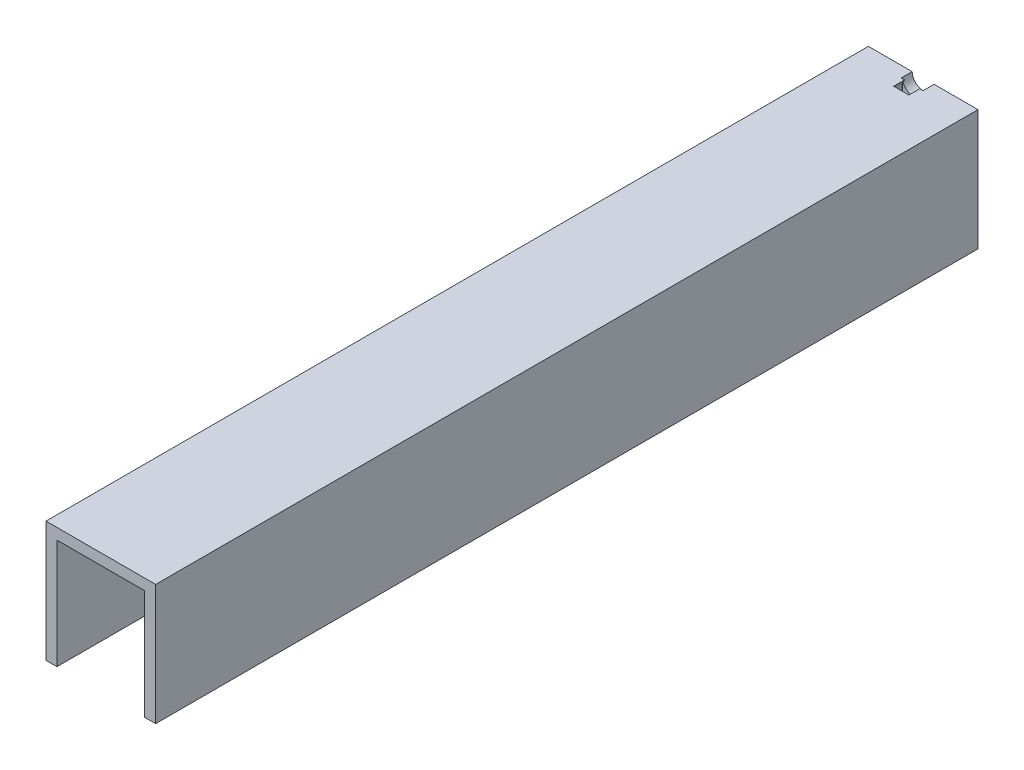
ISO-10303-21;
HEADER;
FILE_DESCRIPTION(('STEP AP214'),'2;1');
FILE_NAME('part.step','',(''),(''),'','','');
FILE_SCHEMA(('AUTOMOTIVE_DESIGN { 1 0 10303 214 1 1 1 1 }'));
ENDSEC;
DATA;
#1=APPLICATION_CONTEXT('core data for automotive mechanical design processes');
#2=APPLICATION_PROTOCOL_DEFINITION('international standard','automotive_design',2000,#1);
#3=PRODUCT_CONTEXT('',#1,'mechanical');
#4=PRODUCT('Part','Part','',(#3));
#5=PRODUCT_RELATED_PRODUCT_CATEGORY('part','',(#4));
#6=PRODUCT_DEFINITION_FORMATION('','',#4);
#7=PRODUCT_DEFINITION_CONTEXT('part definition',#1,'design');
#8=PRODUCT_DEFINITION('design','',#6,#7);
#9=PRODUCT_DEFINITION_SHAPE('','',#8);
#10=(LENGTH_UNIT() NAMED_UNIT(*) SI_UNIT(.MILLI.,.METRE.));
#11=(NAMED_UNIT(*) PLANE_ANGLE_UNIT() SI_UNIT($,.RADIAN.));
#12=(NAMED_UNIT(*) SI_UNIT($,.STERADIAN.) SOLID_ANGLE_UNIT());
#13=UNCERTAINTY_MEASURE_WITH_UNIT(LENGTH_MEASURE(1.E-05),#10,'distance_accuracy_value','');
#14=(GEOMETRIC_REPRESENTATION_CONTEXT(3) GLOBAL_UNCERTAINTY_ASSIGNED_CONTEXT((#13)) GLOBAL_UNIT_ASSIGNED_CONTEXT((#10,
#11,#12)) REPRESENTATION_CONTEXT('',''));
#15=CARTESIAN_POINT('',(0.,0.,0.));
#16=DIRECTION('',(0.,0.,1.));
#17=DIRECTION('',(1.,0.,0.));
#18=AXIS2_PLACEMENT_3D('',#15,#16,#17);
#19=CARTESIAN_POINT('',(0.,40.,0.));
#20=DIRECTION('',(0.,1.,0.));
#21=DIRECTION('',(1.,0.,0.));
#22=AXIS2_PLACEMENT_3D('',#19,#20,#21);
#23=PLANE('',#22);
#24=DIRECTION('',(1.07552855510562E-13,0.,-1.));
#25=VECTOR('',#24,1.);
#26=CARTESIAN_POINT('',(10.,40.,10.));
#27=LINE('',#26,#25);
#28=CARTESIAN_POINT('',(10.,40.,10.));
#29=VERTEX_POINT('',#28);
#30=CARTESIAN_POINT('',(10.,40.,9.));
#31=VERTEX_POINT('',#30);
#32=EDGE_CURVE('E412',#29,#31,#27,.T.);
#33=ORIENTED_EDGE('',*,*,#32,.T.);
#34=DIRECTION('',(-1.,0.,0.));
#35=VECTOR('',#34,1.);
#36=CARTESIAN_POINT('',(10.,40.,9.));
#37=LINE('',#36,#35);
#38=CARTESIAN_POINT('',(-10.,40.,9.));
#39=VERTEX_POINT('',#38);
#40=EDGE_CURVE('E28',#31,#39,#37,.T.);
#41=ORIENTED_EDGE('',*,*,#40,.T.);
#42=DIRECTION('',(1.14491749414469E-13,0.,1.));
#43=VECTOR('',#42,1.);
#44=CARTESIAN_POINT('',(-10.,40.,10.));
#45=LINE('',#44,#43);
#46=CARTESIAN_POINT('',(-10.,40.,10.));
#47=VERTEX_POINT('',#46);
#48=EDGE_CURVE('E10',#39,#47,#45,.T.);
#49=ORIENTED_EDGE('',*,*,#48,.T.);
#50=DIRECTION('',(1.,0.,0.));
#51=VECTOR('',#50,1.);
#52=CARTESIAN_POINT('',(-6.94658370459002,40.,10.));
#53=LINE('',#52,#51);
#54=EDGE_CURVE('E331',#47,#29,#53,.T.);
#55=ORIENTED_EDGE('',*,*,#54,.T.);
#56=EDGE_LOOP('',(#33,#41,#49,#55));
#57=FACE_BOUND('',#56,.T.);
#58=ADVANCED_FACE('F15',(#57),#23,.T.);
#59=CARTESIAN_POINT('',(-10.,40.,10.));
#60=DIRECTION('',(-1.,0.,1.14491749414469E-13));
#61=DIRECTION('',(0.,1.,0.));
#62=AXIS2_PLACEMENT_3D('',#59,#60,#61);
#63=PLANE('',#62);
#64=DIRECTION('',(0.,0.,-1.));
#65=VECTOR('',#64,1.);
#66=CARTESIAN_POINT('',(-10.,55.,10.));
#67=LINE('',#66,#65);
#68=CARTESIAN_POINT('',(-10.,55.,10.));
#69=VERTEX_POINT('',#68);
#70=CARTESIAN_POINT('',(-10.,55.,9.));
#71=VERTEX_POINT('',#70);
#72=EDGE_CURVE('E292',#69,#71,#67,.T.);
#73=ORIENTED_EDGE('',*,*,#72,.F.);
#74=DIRECTION('',(0.,1.,0.));
#75=VECTOR('',#74,1.);
#76=CARTESIAN_POINT('',(-10.,40.,10.));
#77=LINE('',#76,#75);
#78=CARTESIAN_POINT('',(-10.,45.,10.));
#79=VERTEX_POINT('',#78);
#80=EDGE_CURVE('E311',#79,#69,#77,.T.);
#81=ORIENTED_EDGE('',*,*,#80,.F.);
#82=DIRECTION('',(0.,1.,0.));
#83=VECTOR('',#82,1.);
#84=CARTESIAN_POINT('',(-10.,40.,10.));
#85=LINE('',#84,#83);
#86=EDGE_CURVE('E325',#47,#79,#85,.T.);
#87=ORIENTED_EDGE('',*,*,#86,.F.);
#88=ORIENTED_EDGE('',*,*,#48,.F.);
#89=DIRECTION('',(0.,1.,0.));
#90=VECTOR('',#89,1.);
#91=CARTESIAN_POINT('',(-10.,40.,9.));
#92=LINE('',#91,#90);
#93=EDGE_CURVE('E416',#39,#71,#92,.T.);
#94=ORIENTED_EDGE('',*,*,#93,.T.);
#95=EDGE_LOOP('',(#73,#81,#87,#88,#94));
#96=FACE_BOUND('',#95,.T.);
#97=ADVANCED_FACE('F268',(#96),#63,.F.);
#98=CARTESIAN_POINT('',(10.,40.,9.));
#99=DIRECTION('',(0.,0.,-1.));
#100=DIRECTION('',(0.,-1.,0.));
#101=AXIS2_PLACEMENT_3D('',#98,#99,#100);
#102=PLANE('',#101);
#103=CARTESIAN_POINT('',(0.,55.,9.));
#104=DIRECTION('',(0.,0.,-1.));
#105=DIRECTION('',(-1.,0.,0.));
#106=AXIS2_PLACEMENT_3D('',#103,#104,#105);
#107=CIRCLE('',#106,10.);
#108=CARTESIAN_POINT('',(10.,55.,9.));
#109=VERTEX_POINT('',#108);
#110=EDGE_CURVE('E350',#109,#71,#107,.T.);
#111=ORIENTED_EDGE('',*,*,#110,.T.);
#112=ORIENTED_EDGE('',*,*,#93,.F.);
#113=ORIENTED_EDGE('',*,*,#40,.F.);
#114=DIRECTION('',(0.,1.,0.));
#115=VECTOR('',#114,1.);
#116=CARTESIAN_POINT('',(10.,40.,9.));
#117=LINE('',#116,#115);
#118=EDGE_CURVE('E349',#31,#109,#117,.T.);
#119=ORIENTED_EDGE('',*,*,#118,.T.);
#120=EDGE_LOOP('',(#111,#112,#113,#119));
#121=FACE_BOUND('',#120,.T.);
#122=ADVANCED_FACE('F645',(#121),#102,.F.);
#123=CARTESIAN_POINT('',(10.,40.,10.));
#124=DIRECTION('',(1.,0.,1.07552855510562E-13));
#125=DIRECTION('',(-1.07552855510562E-13,0.,1.));
#126=AXIS2_PLACEMENT_3D('',#123,#124,#125);
#127=PLANE('',#126);
#128=DIRECTION('',(0.,0.,-1.));
#129=VECTOR('',#128,1.);
#130=CARTESIAN_POINT('',(10.,55.,10.));
#131=LINE('',#130,#129);
#132=CARTESIAN_POINT('',(10.,55.,10.));
#133=VERTEX_POINT('',#132);
#134=EDGE_CURVE('E176',#133,#109,#131,.T.);
#135=ORIENTED_EDGE('',*,*,#134,.T.);
#136=ORIENTED_EDGE('',*,*,#118,.F.);
#137=ORIENTED_EDGE('',*,*,#32,.F.);
#138=DIRECTION('',(0.,1.,0.));
#139=VECTOR('',#138,1.);
#140=CARTESIAN_POINT('',(10.,40.,10.));
#141=LINE('',#140,#139);
#142=CARTESIAN_POINT('',(10.,45.,10.));
#143=VERTEX_POINT('',#142);
#144=EDGE_CURVE('E361',#29,#143,#141,.T.);
#145=ORIENTED_EDGE('',*,*,#144,.T.);
#146=DIRECTION('',(0.,1.,0.));
#147=VECTOR('',#146,1.);
#148=CARTESIAN_POINT('',(10.,40.,10.));
#149=LINE('',#148,#147);
#150=EDGE_CURVE('E136',#143,#133,#149,.T.);
#151=ORIENTED_EDGE('',*,*,#150,.T.);
#152=EDGE_LOOP('',(#135,#136,#137,#145,#151));
#153=FACE_BOUND('',#152,.T.);
#154=ADVANCED_FACE('F195',(#153),#127,.F.);
#155=CARTESIAN_POINT('',(0.,55.,10.));
#156=DIRECTION('',(0.,0.,1.));
#157=DIRECTION('',(1.,0.,0.));
#158=AXIS2_PLACEMENT_3D('',#155,#156,#157);
#159=PLANE('',#158);
#160=CARTESIAN_POINT('',(-9.99695367108951,45.,10.));
#161=CARTESIAN_POINT('',(-9.96494319264532,46.8664581448352,10.));
#162=CARTESIAN_POINT('',(-9.39001372180576,50.5804550021323,10.));
#163=CARTESIAN_POINT('',(-7.87952848473726,53.7030541342102,10.));
#164=CARTESIAN_POINT('',(-6.94658370459002,55.,10.));
#165=(BOUNDED_CURVE() B_SPLINE_CURVE(3,(#160,#161,#162,#163,#164),.UNSPECIFIED.,.F.,
.F.) B_SPLINE_CURVE_WITH_KNOTS((4,1,4),(0.767944870877509,1.15702863061443,1.54611239035136),
.UNSPECIFIED.) CURVE() GEOMETRIC_REPRESENTATION_ITEM() RATIONAL_B_SPLINE_CURVE((1.,1.,1.,1.,1.)) REPRESENTATION_ITEM(''));
#166=CARTESIAN_POINT('',(-6.94658370459002,55.,10.));
#167=VERTEX_POINT('',#166);
#168=CARTESIAN_POINT('',(-9.99695367108951,45.,10.));
#169=VERTEX_POINT('',#168);
#170=EDGE_CURVE('E113',#167,#169,#165,.F.);
#171=ORIENTED_EDGE('',*,*,#170,.T.);
#172=DIRECTION('',(-1.,0.,0.));
#173=VECTOR('',#172,1.);
#174=CARTESIAN_POINT('',(50.,45.,10.));
#175=LINE('',#174,#173);
#176=EDGE_CURVE('E147',#169,#79,#175,.T.);
#177=ORIENTED_EDGE('',*,*,#176,.T.);
#178=ORIENTED_EDGE('',*,*,#80,.T.);
#179=DIRECTION('',(-1.,0.,0.));
#180=VECTOR('',#179,1.);
#181=CARTESIAN_POINT('',(0.,55.,10.));
#182=LINE('',#181,#180);
#183=EDGE_CURVE('E288',#167,#69,#182,.T.);
#184=ORIENTED_EDGE('',*,*,#183,.F.);
#185=EDGE_LOOP('',(#171,#177,#178,#184));
#186=FACE_BOUND('',#185,.T.);
#187=ADVANCED_FACE('F184',(#186),#159,.F.);
#188=CARTESIAN_POINT('',(0.,55.,10.));
#189=DIRECTION('',(0.,0.,-1.));
#190=DIRECTION('',(-1.,0.,0.));
#191=AXIS2_PLACEMENT_3D('',#188,#189,#190);
#192=CYLINDRICAL_SURFACE('',#191,10.);
#193=ORIENTED_EDGE('',*,*,#110,.F.);
#194=DIRECTION('',(0.,0.,-1.));
#195=VECTOR('',#194,1.);
#196=CARTESIAN_POINT('',(10.,55.,10.));
#197=LINE('',#196,#195);
#198=CARTESIAN_POINT('',(10.,55.,0.));
#199=VERTEX_POINT('',#198);
#200=EDGE_CURVE('E381',#109,#199,#197,.T.);
#201=ORIENTED_EDGE('',*,*,#200,.T.);
#202=CARTESIAN_POINT('',(0.,55.,0.));
#203=DIRECTION('',(0.,0.,1.));
#204=DIRECTION('',(-1.,0.,0.));
#205=AXIS2_PLACEMENT_3D('',#202,#203,#204);
#206=CIRCLE('',#205,10.);
#207=CARTESIAN_POINT('',(-10.,55.,0.));
#208=VERTEX_POINT('',#207);
#209=EDGE_CURVE('E360',#208,#199,#206,.T.);
#210=ORIENTED_EDGE('',*,*,#209,.F.);
#211=DIRECTION('',(0.,0.,-1.));
#212=VECTOR('',#211,1.);
#213=CARTESIAN_POINT('',(-10.,55.,10.));
#214=LINE('',#213,#212);
#215=EDGE_CURVE('E389',#71,#208,#214,.T.);
#216=ORIENTED_EDGE('',*,*,#215,.F.);
#217=EDGE_LOOP('',(#193,#201,#210,#216));
#218=FACE_BOUND('',#217,.T.);
#219=ADVANCED_FACE('F194',(#218),#192,.F.);
#220=CARTESIAN_POINT('',(0.,55.,10.));
#221=DIRECTION('',(0.,0.,1.));
#222=DIRECTION('',(1.,0.,0.));
#223=AXIS2_PLACEMENT_3D('',#220,#221,#222);
#224=PLANE('',#223);
#225=CARTESIAN_POINT('',(6.94658370459002,55.,10.));
#226=CARTESIAN_POINT('',(7.87952848473726,53.7030541342102,10.));
#227=CARTESIAN_POINT('',(9.39001372180576,50.5804550021323,10.));
#228=CARTESIAN_POINT('',(9.96494319264532,46.8664581448352,10.));
#229=CARTESIAN_POINT('',(9.99695367108951,45.,10.));
#230=(BOUNDED_CURVE() B_SPLINE_CURVE(3,(#225,#226,#227,#228,#229),.UNSPECIFIED.,.F.,
.F.) B_SPLINE_CURVE_WITH_KNOTS((4,1,4),(4.73707291682822,5.12615667656515,5.51524043630208),
.UNSPECIFIED.) CURVE() GEOMETRIC_REPRESENTATION_ITEM() RATIONAL_B_SPLINE_CURVE((1.,1.,1.,1.,1.)) REPRESENTATION_ITEM(''));
#231=CARTESIAN_POINT('',(9.99695367108951,45.,10.));
#232=VERTEX_POINT('',#231);
#233=CARTESIAN_POINT('',(6.94658370458999,55.,10.));
#234=VERTEX_POINT('',#233);
#235=EDGE_CURVE('E121',#232,#234,#230,.F.);
#236=ORIENTED_EDGE('',*,*,#235,.T.);
#237=DIRECTION('',(-1.,0.,0.));
#238=VECTOR('',#237,1.);
#239=CARTESIAN_POINT('',(0.,55.,10.));
#240=LINE('',#239,#238);
#241=EDGE_CURVE('E171',#133,#234,#240,.T.);
#242=ORIENTED_EDGE('',*,*,#241,.F.);
#243=ORIENTED_EDGE('',*,*,#150,.F.);
#244=DIRECTION('',(-1.,0.,0.));
#245=VECTOR('',#244,1.);
#246=CARTESIAN_POINT('',(50.,45.,10.));
#247=LINE('',#246,#245);
#248=EDGE_CURVE('E140',#143,#232,#247,.T.);
#249=ORIENTED_EDGE('',*,*,#248,.T.);
#250=EDGE_LOOP('',(#236,#242,#243,#249));
#251=FACE_BOUND('',#250,.T.);
#252=ADVANCED_FACE('F141',(#251),#224,.F.);
#253=CARTESIAN_POINT('',(9.99695367108951,45.,20.));
#254=CARTESIAN_POINT('',(9.99695367108951,45.,10.));
#255=CARTESIAN_POINT('',(9.96494319264532,46.8664581448352,20.));
#256=CARTESIAN_POINT('',(9.96494319264532,46.8664581448352,10.));
#257=CARTESIAN_POINT('',(9.39001372180576,50.5804550021323,20.));
#258=CARTESIAN_POINT('',(9.39001372180576,50.5804550021323,10.));
#259=CARTESIAN_POINT('',(7.87952848473726,53.7030541342102,20.));
#260=CARTESIAN_POINT('',(7.87952848473726,53.7030541342102,10.));
#261=CARTESIAN_POINT('',(6.94658370459002,55.,20.));
#262=CARTESIAN_POINT('',(6.94658370459002,55.,10.));
#263=(BOUNDED_SURFACE() B_SPLINE_SURFACE(3,1,((#253,#254),(#255,#256),(#257,#258),(#259,#260),
(#261,#262)),.UNSPECIFIED.,.F.,.F.,.F.) B_SPLINE_SURFACE_WITH_KNOTS((4,1,4),(2,2),
(4.73707291682822,5.12615667656515,5.51524043630208),(0.,1.),
.UNSPECIFIED.) GEOMETRIC_REPRESENTATION_ITEM() RATIONAL_B_SPLINE_SURFACE(((1.,1.),(1.,1.),(1.,
1.),(1.,1.),(1.,1.))) REPRESENTATION_ITEM('') SURFACE());
#264=CARTESIAN_POINT('',(9.99695367108951,45.,20.));
#265=CARTESIAN_POINT('',(9.96494319264532,46.8664581448352,20.));
#266=CARTESIAN_POINT('',(9.39001372180576,50.5804550021323,20.));
#267=CARTESIAN_POINT('',(7.87952848473726,53.7030541342102,20.));
#268=CARTESIAN_POINT('',(6.94658370459002,55.,20.));
#269=(BOUNDED_CURVE() B_SPLINE_CURVE(3,(#264,#265,#266,#267,#268),.UNSPECIFIED.,.F.,
.F.) B_SPLINE_CURVE_WITH_KNOTS((4,1,4),(4.73707291682822,5.12615667656515,5.51524043630208),
.UNSPECIFIED.) CURVE() GEOMETRIC_REPRESENTATION_ITEM() RATIONAL_B_SPLINE_CURVE((1.,1.,1.,1.,1.)) REPRESENTATION_ITEM(''));
#270=CARTESIAN_POINT('',(6.94658370459002,55.,20.));
#271=VERTEX_POINT('',#270);
#272=CARTESIAN_POINT('',(9.99695367108951,45.,20.));
#273=VERTEX_POINT('',#272);
#274=EDGE_CURVE('E225',#271,#273,#269,.F.);
#275=DIRECTION('',(0.,0.,-1.));
#276=VECTOR('',#275,1.);
#277=CARTESIAN_POINT('',(6.94658370459002,55.,24.0249035518016));
#278=LINE('',#277,#276);
#279=EDGE_CURVE('E130',#271,#234,#278,.T.);
#280=DIRECTION('',(0.,0.,-1.));
#281=VECTOR('',#280,1.);
#282=CARTESIAN_POINT('',(9.99695367108951,45.,24.0249035518016));
#283=LINE('',#282,#281);
#284=EDGE_CURVE('E127',#273,#232,#283,.T.);
#285=ORIENTED_EDGE('',*,*,#274,.F.);
#286=ORIENTED_EDGE('',*,*,#279,.T.);
#287=ORIENTED_EDGE('',*,*,#235,.F.);
#288=ORIENTED_EDGE('',*,*,#284,.F.);
#289=EDGE_LOOP('',(#285,#286,#287,#288));
#290=FACE_BOUND('',#289,.T.);
#291=ADVANCED_FACE('F125',(#290),#263,.T.);
#292=CARTESIAN_POINT('',(-6.94658370459002,55.,20.));
#293=CARTESIAN_POINT('',(-6.94658370459002,55.,10.));
#294=CARTESIAN_POINT('',(-7.87952848473726,53.7030541342102,20.));
#295=CARTESIAN_POINT('',(-7.87952848473726,53.7030541342102,10.));
#296=CARTESIAN_POINT('',(-9.39001372180576,50.5804550021323,20.));
#297=CARTESIAN_POINT('',(-9.39001372180576,50.5804550021323,10.));
#298=CARTESIAN_POINT('',(-9.96494319264532,46.8664581448352,20.));
#299=CARTESIAN_POINT('',(-9.96494319264532,46.8664581448352,10.));
#300=CARTESIAN_POINT('',(-9.99695367108951,45.,20.));
#301=CARTESIAN_POINT('',(-9.99695367108951,45.,10.));
#302=(BOUNDED_SURFACE() B_SPLINE_SURFACE(3,1,((#292,#293),(#294,#295),(#296,#297),(#298,#299),
(#300,#301)),.UNSPECIFIED.,.F.,.F.,.F.) B_SPLINE_SURFACE_WITH_KNOTS((4,1,4),(2,2),
(0.767944870877509,1.15702863061444,1.54611239035136),(0.,1.),
.UNSPECIFIED.) GEOMETRIC_REPRESENTATION_ITEM() RATIONAL_B_SPLINE_SURFACE(((1.,1.),(1.,1.),(1.,
1.),(1.,1.),(1.,1.))) REPRESENTATION_ITEM('') SURFACE());
#303=CARTESIAN_POINT('',(-6.94658370459002,55.,20.));
#304=CARTESIAN_POINT('',(-7.87952848473726,53.7030541342102,20.));
#305=CARTESIAN_POINT('',(-9.39001372180576,50.5804550021323,20.));
#306=CARTESIAN_POINT('',(-9.96494319264532,46.8664581448352,20.));
#307=CARTESIAN_POINT('',(-9.99695367108951,45.,20.));
#308=(BOUNDED_CURVE() B_SPLINE_CURVE(3,(#303,#304,#305,#306,#307),.UNSPECIFIED.,.F.,
.F.) B_SPLINE_CURVE_WITH_KNOTS((4,1,4),(0.767944870877509,1.15702863061444,1.54611239035136),
.UNSPECIFIED.) CURVE() GEOMETRIC_REPRESENTATION_ITEM() RATIONAL_B_SPLINE_CURVE((1.,1.,1.,1.,1.)) REPRESENTATION_ITEM(''));
#309=CARTESIAN_POINT('',(-9.99695367108951,45.,20.));
#310=VERTEX_POINT('',#309);
#311=CARTESIAN_POINT('',(-6.94658370459002,55.,20.));
#312=VERTEX_POINT('',#311);
#313=EDGE_CURVE('E234',#310,#312,#308,.F.);
#314=DIRECTION('',(0.,0.,-1.));
#315=VECTOR('',#314,1.);
#316=CARTESIAN_POINT('',(-9.99695367108951,45.,24.0249035518016));
#317=LINE('',#316,#315);
#318=EDGE_CURVE('E296',#310,#169,#317,.T.);
#319=DIRECTION('',(0.,0.,-1.));
#320=VECTOR('',#319,1.);
#321=CARTESIAN_POINT('',(-6.94658370459002,55.,24.0249035518016));
#322=LINE('',#321,#320);
#323=EDGE_CURVE('E162',#312,#167,#322,.T.);
#324=ORIENTED_EDGE('',*,*,#313,.F.);
#325=ORIENTED_EDGE('',*,*,#318,.T.);
#326=ORIENTED_EDGE('',*,*,#170,.F.);
#327=ORIENTED_EDGE('',*,*,#323,.F.);
#328=EDGE_LOOP('',(#324,#325,#326,#327));
#329=FACE_BOUND('',#328,.T.);
#330=ADVANCED_FACE('F255',(#329),#302,.T.);
#331=CARTESIAN_POINT('',(50.,45.,750.));
#332=DIRECTION('',(0.,-1.,0.));
#333=DIRECTION('',(0.,0.,-1.));
#334=AXIS2_PLACEMENT_3D('',#331,#332,#333);
#335=PLANE('',#334);
#336=DIRECTION('',(-1.,0.,0.));
#337=VECTOR('',#336,1.);
#338=CARTESIAN_POINT('',(10.,45.,20.));
#339=LINE('',#338,#337);
#340=EDGE_CURVE('E152',#273,#310,#339,.T.);
#341=ORIENTED_EDGE('',*,*,#340,.F.);
#342=ORIENTED_EDGE('',*,*,#284,.T.);
#343=ORIENTED_EDGE('',*,*,#248,.F.);
#344=DIRECTION('',(-1.,0.,0.));
#345=VECTOR('',#344,1.);
#346=CARTESIAN_POINT('',(50.,45.,10.));
#347=LINE('',#346,#345);
#348=CARTESIAN_POINT('',(40.,45.,10.));
#349=VERTEX_POINT('',#348);
#350=EDGE_CURVE('E362',#349,#143,#347,.T.);
#351=ORIENTED_EDGE('',*,*,#350,.F.);
#352=DIRECTION('',(0.,0.,-1.));
#353=VECTOR('',#352,1.);
#354=CARTESIAN_POINT('',(40.,45.,750.));
#355=LINE('',#354,#353);
#356=CARTESIAN_POINT('',(40.,45.,750.));
#357=VERTEX_POINT('',#356);
#358=EDGE_CURVE('E417',#357,#349,#355,.T.);
#359=ORIENTED_EDGE('',*,*,#358,.F.);
#360=DIRECTION('',(-1.,0.,0.));
#361=VECTOR('',#360,1.);
#362=CARTESIAN_POINT('',(50.,45.,750.));
#363=LINE('',#362,#361);
#364=CARTESIAN_POINT('',(-40.,45.,750.));
#365=VERTEX_POINT('',#364);
#366=EDGE_CURVE('E470',#357,#365,#363,.T.);
#367=ORIENTED_EDGE('',*,*,#366,.T.);
#368=DIRECTION('',(0.,0.,-1.));
#369=VECTOR('',#368,1.);
#370=CARTESIAN_POINT('',(-40.,45.,750.));
#371=LINE('',#370,#369);
#372=CARTESIAN_POINT('',(-40.,45.,10.));
#373=VERTEX_POINT('',#372);
#374=EDGE_CURVE('E155',#365,#373,#371,.T.);
#375=ORIENTED_EDGE('',*,*,#374,.T.);
#376=DIRECTION('',(-1.,0.,0.));
#377=VECTOR('',#376,1.);
#378=CARTESIAN_POINT('',(50.,45.,10.));
#379=LINE('',#378,#377);
#380=EDGE_CURVE('E316',#79,#373,#379,.T.);
#381=ORIENTED_EDGE('',*,*,#380,.F.);
#382=ORIENTED_EDGE('',*,*,#176,.F.);
#383=ORIENTED_EDGE('',*,*,#318,.F.);
#384=EDGE_LOOP('',(#341,#342,#343,#351,#359,#367,#375,#381,#382,#383));
#385=FACE_BOUND('',#384,.T.);
#386=ADVANCED_FACE('F149',(#385),#335,.T.);
#387=CARTESIAN_POINT('',(-40.,55.,750.));
#388=DIRECTION('',(1.,0.,0.));
#389=DIRECTION('',(0.,1.,0.));
#390=AXIS2_PLACEMENT_3D('',#387,#388,#389);
#391=PLANE('',#390);
#392=DIRECTION('',(0.,-1.,0.));
#393=VECTOR('',#392,1.);
#394=CARTESIAN_POINT('',(-40.,55.,10.));
#395=LINE('',#394,#393);
#396=CARTESIAN_POINT('',(-40.,-55.,10.));
#397=VERTEX_POINT('',#396);
#398=EDGE_CURVE('E324',#373,#397,#395,.T.);
#399=ORIENTED_EDGE('',*,*,#398,.F.);
#400=ORIENTED_EDGE('',*,*,#374,.F.);
#401=DIRECTION('',(0.,-1.,0.));
#402=VECTOR('',#401,1.);
#403=CARTESIAN_POINT('',(-40.,55.,750.));
#404=LINE('',#403,#402);
#405=CARTESIAN_POINT('',(-40.,-55.,750.));
#406=VERTEX_POINT('',#405);
#407=EDGE_CURVE('E374',#365,#406,#404,.T.);
#408=ORIENTED_EDGE('',*,*,#407,.T.);
#409=DIRECTION('',(0.,0.,-1.));
#410=VECTOR('',#409,1.);
#411=CARTESIAN_POINT('',(-40.,-55.,750.));
#412=LINE('',#411,#410);
#413=EDGE_CURVE('E385',#406,#397,#412,.T.);
#414=ORIENTED_EDGE('',*,*,#413,.T.);
#415=EDGE_LOOP('',(#399,#400,#408,#414));
#416=FACE_BOUND('',#415,.T.);
#417=ADVANCED_FACE('F520',(#416),#391,.T.);
#418=CARTESIAN_POINT('',(50.,55.,750.));
#419=DIRECTION('',(0.,-1.,0.));
#420=DIRECTION('',(0.,0.,-1.));
#421=AXIS2_PLACEMENT_3D('',#418,#419,#420);
#422=PLANE('',#421);
#423=ORIENTED_EDGE('',*,*,#183,.T.);
#424=ORIENTED_EDGE('',*,*,#72,.T.);
#425=ORIENTED_EDGE('',*,*,#215,.T.);
#426=DIRECTION('',(-1.,0.,0.));
#427=VECTOR('',#426,1.);
#428=CARTESIAN_POINT('',(50.,55.,0.));
#429=LINE('',#428,#427);
#430=CARTESIAN_POINT('',(-50.,55.,0.));
#431=VERTEX_POINT('',#430);
#432=EDGE_CURVE('E356',#208,#431,#429,.T.);
#433=ORIENTED_EDGE('',*,*,#432,.T.);
#434=DIRECTION('',(0.,0.,-1.));
#435=VECTOR('',#434,1.);
#436=CARTESIAN_POINT('',(-50.,55.,750.));
#437=LINE('',#436,#435);
#438=CARTESIAN_POINT('',(-50.,55.,750.));
#439=VERTEX_POINT('',#438);
#440=EDGE_CURVE('E382',#439,#431,#437,.T.);
#441=ORIENTED_EDGE('',*,*,#440,.F.);
#442=DIRECTION('',(-1.,0.,0.));
#443=VECTOR('',#442,1.);
#444=CARTESIAN_POINT('',(50.,55.,750.));
#445=LINE('',#444,#443);
#446=CARTESIAN_POINT('',(50.,55.,750.));
#447=VERTEX_POINT('',#446);
#448=EDGE_CURVE('E429',#447,#439,#445,.T.);
#449=ORIENTED_EDGE('',*,*,#448,.F.);
#450=DIRECTION('',(0.,0.,-1.));
#451=VECTOR('',#450,1.);
#452=CARTESIAN_POINT('',(50.,55.,750.));
#453=LINE('',#452,#451);
#454=CARTESIAN_POINT('',(50.,55.,0.));
#455=VERTEX_POINT('',#454);
#456=EDGE_CURVE('E293',#447,#455,#453,.T.);
#457=ORIENTED_EDGE('',*,*,#456,.T.);
#458=DIRECTION('',(-1.,0.,0.));
#459=VECTOR('',#458,1.);
#460=CARTESIAN_POINT('',(50.,55.,0.));
#461=LINE('',#460,#459);
#462=EDGE_CURVE('E369',#455,#199,#461,.T.);
#463=ORIENTED_EDGE('',*,*,#462,.T.);
#464=ORIENTED_EDGE('',*,*,#200,.F.);
#465=ORIENTED_EDGE('',*,*,#134,.F.);
#466=ORIENTED_EDGE('',*,*,#241,.T.);
#467=ORIENTED_EDGE('',*,*,#279,.F.);
#468=DIRECTION('',(-1.,0.,0.));
#469=VECTOR('',#468,1.);
#470=CARTESIAN_POINT('',(50.,55.,20.));
#471=LINE('',#470,#469);
#472=EDGE_CURVE('E230',#271,#312,#471,.T.);
#473=ORIENTED_EDGE('',*,*,#472,.T.);
#474=ORIENTED_EDGE('',*,*,#323,.T.);
#475=EDGE_LOOP('',(#423,#424,#425,#433,#441,#449,#457,#463,#464,#465,#466,#467,#473,#474));
#476=FACE_BOUND('',#475,.T.);
#477=ADVANCED_FACE('F201',(#476),#422,.F.);
#478=CARTESIAN_POINT('',(50.,-55.,750.));
#479=DIRECTION('',(-1.,0.,0.));
#480=DIRECTION('',(0.,0.,1.));
#481=AXIS2_PLACEMENT_3D('',#478,#479,#480);
#482=PLANE('',#481);
#483=DIRECTION('',(0.,1.,0.));
#484=VECTOR('',#483,1.);
#485=CARTESIAN_POINT('',(50.,-55.,0.));
#486=LINE('',#485,#484);
#487=CARTESIAN_POINT('',(50.,-55.,0.));
#488=VERTEX_POINT('',#487);
#489=EDGE_CURVE('E393',#488,#455,#486,.T.);
#490=ORIENTED_EDGE('',*,*,#489,.T.);
#491=ORIENTED_EDGE('',*,*,#456,.F.);
#492=DIRECTION('',(0.,1.,0.));
#493=VECTOR('',#492,1.);
#494=CARTESIAN_POINT('',(50.,-55.,750.));
#495=LINE('',#494,#493);
#496=CARTESIAN_POINT('',(50.,-55.,750.));
#497=VERTEX_POINT('',#496);
#498=EDGE_CURVE('E408',#497,#447,#495,.T.);
#499=ORIENTED_EDGE('',*,*,#498,.F.);
#500=DIRECTION('',(0.,0.,-1.));
#501=VECTOR('',#500,1.);
#502=CARTESIAN_POINT('',(50.,-55.,750.));
#503=LINE('',#502,#501);
#504=EDGE_CURVE('E340',#497,#488,#503,.T.);
#505=ORIENTED_EDGE('',*,*,#504,.T.);
#506=EDGE_LOOP('',(#490,#491,#499,#505));
#507=FACE_BOUND('',#506,.T.);
#508=ADVANCED_FACE('F197',(#507),#482,.F.);
#509=CARTESIAN_POINT('',(-50.,-55.,750.));
#510=DIRECTION('',(0.,1.,0.));
#511=DIRECTION('',(1.,0.,0.));
#512=AXIS2_PLACEMENT_3D('',#509,#510,#511);
#513=PLANE('',#512);
#514=DIRECTION('',(1.,0.,0.));
#515=VECTOR('',#514,1.);
#516=CARTESIAN_POINT('',(-50.,-55.,750.));
#517=LINE('',#516,#515);
#518=CARTESIAN_POINT('',(40.,-55.,750.));
#519=VERTEX_POINT('',#518);
#520=EDGE_CURVE('E355',#519,#497,#517,.T.);
#521=ORIENTED_EDGE('',*,*,#520,.F.);
#522=DIRECTION('',(0.,0.,-1.));
#523=VECTOR('',#522,1.);
#524=CARTESIAN_POINT('',(40.,-55.,750.));
#525=LINE('',#524,#523);
#526=CARTESIAN_POINT('',(40.,-55.,10.));
#527=VERTEX_POINT('',#526);
#528=EDGE_CURVE('E420',#519,#527,#525,.T.);
#529=ORIENTED_EDGE('',*,*,#528,.T.);
#530=DIRECTION('',(1.,0.,0.));
#531=VECTOR('',#530,1.);
#532=CARTESIAN_POINT('',(-50.,-55.,10.));
#533=LINE('',#532,#531);
#534=EDGE_CURVE('E342',#397,#527,#533,.T.);
#535=ORIENTED_EDGE('',*,*,#534,.F.);
#536=ORIENTED_EDGE('',*,*,#413,.F.);
#537=DIRECTION('',(1.,0.,0.));
#538=VECTOR('',#537,1.);
#539=CARTESIAN_POINT('',(-50.,-55.,750.));
#540=LINE('',#539,#538);
#541=CARTESIAN_POINT('',(-50.,-55.,750.));
#542=VERTEX_POINT('',#541);
#543=EDGE_CURVE('E370',#542,#406,#540,.T.);
#544=ORIENTED_EDGE('',*,*,#543,.F.);
#545=DIRECTION('',(0.,0.,-1.));
#546=VECTOR('',#545,1.);
#547=CARTESIAN_POINT('',(-50.,-55.,750.));
#548=LINE('',#547,#546);
#549=CARTESIAN_POINT('',(-50.,-55.,0.));
#550=VERTEX_POINT('',#549);
#551=EDGE_CURVE('E386',#542,#550,#548,.T.);
#552=ORIENTED_EDGE('',*,*,#551,.T.);
#553=DIRECTION('',(1.,0.,0.));
#554=VECTOR('',#553,1.);
#555=CARTESIAN_POINT('',(-50.,-55.,0.));
#556=LINE('',#555,#554);
#557=EDGE_CURVE('E244',#550,#488,#556,.T.);
#558=ORIENTED_EDGE('',*,*,#557,.T.);
#559=ORIENTED_EDGE('',*,*,#504,.F.);
#560=EDGE_LOOP('',(#521,#529,#535,#536,#544,#552,#558,#559));
#561=FACE_BOUND('',#560,.T.);
#562=ADVANCED_FACE('F200',(#561),#513,.F.);
#563=CARTESIAN_POINT('',(-50.,55.,750.));
#564=DIRECTION('',(1.,0.,0.));
#565=DIRECTION('',(0.,1.,0.));
#566=AXIS2_PLACEMENT_3D('',#563,#564,#565);
#567=PLANE('',#566);
#568=DIRECTION('',(0.,-1.,0.));
#569=VECTOR('',#568,1.);
#570=CARTESIAN_POINT('',(-50.,55.,0.));
#571=LINE('',#570,#569);
#572=EDGE_CURVE('E238',#431,#550,#571,.T.);
#573=ORIENTED_EDGE('',*,*,#572,.T.);
#574=ORIENTED_EDGE('',*,*,#551,.F.);
#575=DIRECTION('',(0.,-1.,0.));
#576=VECTOR('',#575,1.);
#577=CARTESIAN_POINT('',(-50.,55.,750.));
#578=LINE('',#577,#576);
#579=EDGE_CURVE('E375',#439,#542,#578,.T.);
#580=ORIENTED_EDGE('',*,*,#579,.F.);
#581=ORIENTED_EDGE('',*,*,#440,.T.);
#582=EDGE_LOOP('',(#573,#574,#580,#581));
#583=FACE_BOUND('',#582,.T.);
#584=ADVANCED_FACE('F457',(#583),#567,.F.);
#585=CARTESIAN_POINT('',(40.,-55.,750.));
#586=DIRECTION('',(-1.,0.,0.));
#587=DIRECTION('',(0.,0.,1.));
#588=AXIS2_PLACEMENT_3D('',#585,#586,#587);
#589=PLANE('',#588);
#590=DIRECTION('',(0.,1.,0.));
#591=VECTOR('',#590,1.);
#592=CARTESIAN_POINT('',(40.,-55.,10.));
#593=LINE('',#592,#591);
#594=EDGE_CURVE('E346',#527,#349,#593,.T.);
#595=ORIENTED_EDGE('',*,*,#594,.F.);
#596=ORIENTED_EDGE('',*,*,#528,.F.);
#597=DIRECTION('',(0.,1.,0.));
#598=VECTOR('',#597,1.);
#599=CARTESIAN_POINT('',(40.,-55.,750.));
#600=LINE('',#599,#598);
#601=EDGE_CURVE('E351',#519,#357,#600,.T.);
#602=ORIENTED_EDGE('',*,*,#601,.T.);
#603=ORIENTED_EDGE('',*,*,#358,.T.);
#604=EDGE_LOOP('',(#595,#596,#602,#603));
#605=FACE_BOUND('',#604,.T.);
#606=ADVANCED_FACE('F518',(#605),#589,.T.);
#607=CARTESIAN_POINT('',(0.,0.,750.));
#608=DIRECTION('',(0.,0.,1.));
#609=DIRECTION('',(1.,0.,0.));
#610=AXIS2_PLACEMENT_3D('',#607,#608,#609);
#611=PLANE('',#610);
#612=ORIENTED_EDGE('',*,*,#601,.F.);
#613=ORIENTED_EDGE('',*,*,#520,.T.);
#614=ORIENTED_EDGE('',*,*,#498,.T.);
#615=ORIENTED_EDGE('',*,*,#448,.T.);
#616=ORIENTED_EDGE('',*,*,#579,.T.);
#617=ORIENTED_EDGE('',*,*,#543,.T.);
#618=ORIENTED_EDGE('',*,*,#407,.F.);
#619=ORIENTED_EDGE('',*,*,#366,.F.);
#620=EDGE_LOOP('',(#612,#613,#614,#615,#616,#617,#618,#619));
#621=FACE_BOUND('',#620,.T.);
#622=ADVANCED_FACE('F206',(#621),#611,.T.);
#623=CARTESIAN_POINT('',(10.,93.4344094230918,20.));
#624=DIRECTION('',(0.,0.,1.));
#625=DIRECTION('',(1.,0.,0.));
#626=AXIS2_PLACEMENT_3D('',#623,#624,#625);
#627=PLANE('',#626);
#628=ORIENTED_EDGE('',*,*,#472,.F.);
#629=ORIENTED_EDGE('',*,*,#274,.T.);
#630=ORIENTED_EDGE('',*,*,#340,.T.);
#631=ORIENTED_EDGE('',*,*,#313,.T.);
#632=EDGE_LOOP('',(#628,#629,#630,#631));
#633=FACE_BOUND('',#632,.T.);
#634=ADVANCED_FACE('F203',(#633),#627,.F.);
#635=CARTESIAN_POINT('',(0.,0.,0.));
#636=DIRECTION('',(0.,0.,1.));
#637=DIRECTION('',(1.,0.,0.));
#638=AXIS2_PLACEMENT_3D('',#635,#636,#637);
#639=PLANE('',#638);
#640=ORIENTED_EDGE('',*,*,#432,.F.);
#641=ORIENTED_EDGE('',*,*,#209,.T.);
#642=ORIENTED_EDGE('',*,*,#462,.F.);
#643=ORIENTED_EDGE('',*,*,#489,.F.);
#644=ORIENTED_EDGE('',*,*,#557,.F.);
#645=ORIENTED_EDGE('',*,*,#572,.F.);
#646=EDGE_LOOP('',(#640,#641,#642,#643,#644,#645));
#647=FACE_BOUND('',#646,.T.);
#648=ADVANCED_FACE('F17',(#647),#639,.F.);
#649=CARTESIAN_POINT('',(0.,0.,10.));
#650=DIRECTION('',(0.,0.,1.));
#651=DIRECTION('',(1.,0.,0.));
#652=AXIS2_PLACEMENT_3D('',#649,#650,#651);
#653=PLANE('',#652);
#654=ORIENTED_EDGE('',*,*,#54,.F.);
#655=ORIENTED_EDGE('',*,*,#86,.T.);
#656=ORIENTED_EDGE('',*,*,#380,.T.);
#657=ORIENTED_EDGE('',*,*,#398,.T.);
#658=ORIENTED_EDGE('',*,*,#534,.T.);
#659=ORIENTED_EDGE('',*,*,#594,.T.);
#660=ORIENTED_EDGE('',*,*,#350,.T.);
#661=ORIENTED_EDGE('',*,*,#144,.F.);
#662=EDGE_LOOP('',(#654,#655,#656,#657,#658,#659,#660,#661));
#663=FACE_BOUND('',#662,.T.);
#664=ADVANCED_FACE('F328',(#663),#653,.T.);
#665=CLOSED_SHELL('',(#58,#97,#122,#154,#187,#219,#252,#291,#330,#386,#417,#477,#508,#562,#584,
#606,#622,#634,#648,#664));
#666=MANIFOLD_SOLID_BREP('B1',#665);
#667=ADVANCED_BREP_SHAPE_REPRESENTATION('',(#18,#666),#14);
#668=SHAPE_DEFINITION_REPRESENTATION(#9,#667);
ENDSEC;
END-ISO-10303-21;
